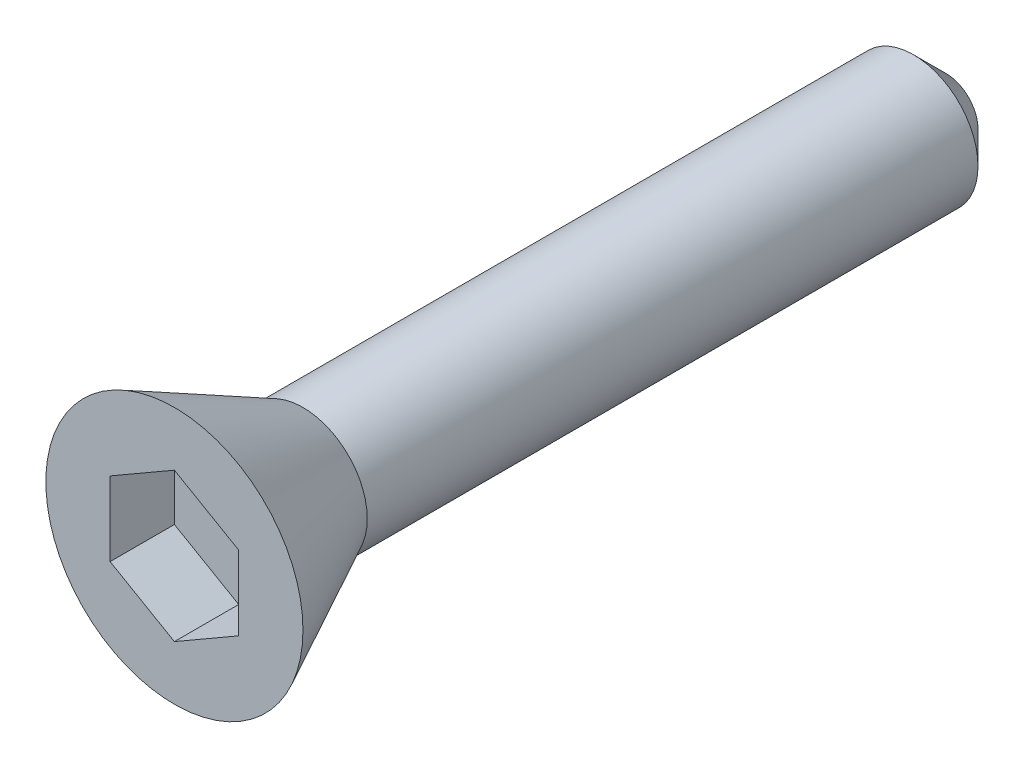
ISO-10303-21;
HEADER;
FILE_DESCRIPTION(('STEP AP214'),'2;1');
FILE_NAME('part.step','',(''),(''),'','','');
FILE_SCHEMA(('AUTOMOTIVE_DESIGN { 1 0 10303 214 1 1 1 1 }'));
ENDSEC;
DATA;
#1=APPLICATION_CONTEXT('core data for automotive mechanical design processes');
#2=APPLICATION_PROTOCOL_DEFINITION('international standard','automotive_design',2000,#1);
#3=PRODUCT_CONTEXT('',#1,'mechanical');
#4=PRODUCT('Part','Part','',(#3));
#5=PRODUCT_RELATED_PRODUCT_CATEGORY('part','',(#4));
#6=PRODUCT_DEFINITION_FORMATION('','',#4);
#7=PRODUCT_DEFINITION_CONTEXT('part definition',#1,'design');
#8=PRODUCT_DEFINITION('design','',#6,#7);
#9=PRODUCT_DEFINITION_SHAPE('','',#8);
#10=(LENGTH_UNIT() NAMED_UNIT(*) SI_UNIT(.MILLI.,.METRE.));
#11=(NAMED_UNIT(*) PLANE_ANGLE_UNIT() SI_UNIT($,.RADIAN.));
#12=(NAMED_UNIT(*) SI_UNIT($,.STERADIAN.) SOLID_ANGLE_UNIT());
#13=UNCERTAINTY_MEASURE_WITH_UNIT(LENGTH_MEASURE(1.E-05),#10,'distance_accuracy_value','');
#14=(GEOMETRIC_REPRESENTATION_CONTEXT(3) GLOBAL_UNCERTAINTY_ASSIGNED_CONTEXT((#13)) GLOBAL_UNIT_ASSIGNED_CONTEXT((#10,
#11,#12)) REPRESENTATION_CONTEXT('',''));
#15=CARTESIAN_POINT('',(0.,0.,0.));
#16=DIRECTION('',(0.,0.,1.));
#17=DIRECTION('',(1.,0.,0.));
#18=AXIS2_PLACEMENT_3D('',#15,#16,#17);
#19=CARTESIAN_POINT('',(0.,0.,0.));
#20=DIRECTION('',(0.,0.,-1.));
#21=DIRECTION('',(-1.,0.,0.));
#22=AXIS2_PLACEMENT_3D('',#19,#20,#21);
#23=PLANE('',#22);
#24=DIRECTION('',(-0.866025403784439,-0.5,0.));
#25=VECTOR('',#24,1.);
#26=CARTESIAN_POINT('',(0.,1.15470053837925,0.));
#27=LINE('',#26,#25);
#28=CARTESIAN_POINT('',(0.,1.15470053837925,0.));
#29=VERTEX_POINT('',#28);
#30=CARTESIAN_POINT('',(-1.,0.577350269189626,0.));
#31=VERTEX_POINT('',#30);
#32=EDGE_CURVE('E121',#29,#31,#27,.T.);
#33=ORIENTED_EDGE('',*,*,#32,.F.);
#34=DIRECTION('',(-0.866025403784439,0.5,0.));
#35=VECTOR('',#34,1.);
#36=CARTESIAN_POINT('',(1.,0.577350269189626,0.));
#37=LINE('',#36,#35);
#38=CARTESIAN_POINT('',(1.,0.577350269189626,0.));
#39=VERTEX_POINT('',#38);
#40=EDGE_CURVE('E47',#39,#29,#37,.T.);
#41=ORIENTED_EDGE('',*,*,#40,.F.);
#42=DIRECTION('',(0.,1.,0.));
#43=VECTOR('',#42,1.);
#44=CARTESIAN_POINT('',(1.,-0.577350269189626,0.));
#45=LINE('',#44,#43);
#46=CARTESIAN_POINT('',(1.,-0.577350269189626,0.));
#47=VERTEX_POINT('',#46);
#48=EDGE_CURVE('E130',#47,#39,#45,.T.);
#49=ORIENTED_EDGE('',*,*,#48,.F.);
#50=DIRECTION('',(0.866025403784439,0.5,0.));
#51=VECTOR('',#50,1.);
#52=CARTESIAN_POINT('',(0.,-1.15470053837925,0.));
#53=LINE('',#52,#51);
#54=CARTESIAN_POINT('',(0.,-1.15470053837925,0.));
#55=VERTEX_POINT('',#54);
#56=EDGE_CURVE('E128',#55,#47,#53,.T.);
#57=ORIENTED_EDGE('',*,*,#56,.F.);
#58=DIRECTION('',(0.866025403784439,-0.5,0.));
#59=VECTOR('',#58,1.);
#60=CARTESIAN_POINT('',(-1.,-0.577350269189626,0.));
#61=LINE('',#60,#59);
#62=CARTESIAN_POINT('',(-1.,-0.577350269189626,0.));
#63=VERTEX_POINT('',#62);
#64=EDGE_CURVE('E95',#63,#55,#61,.T.);
#65=ORIENTED_EDGE('',*,*,#64,.F.);
#66=DIRECTION('',(0.,-1.,0.));
#67=VECTOR('',#66,1.);
#68=CARTESIAN_POINT('',(-1.,0.577350269189626,0.));
#69=LINE('',#68,#67);
#70=EDGE_CURVE('E124',#31,#63,#69,.T.);
#71=ORIENTED_EDGE('',*,*,#70,.F.);
#72=EDGE_LOOP('',(#33,#41,#49,#57,#65,#71));
#73=FACE_BOUND('',#72,.T.);
#74=CARTESIAN_POINT('',(0.,0.,0.));
#75=DIRECTION('',(0.,0.,1.));
#76=DIRECTION('',(1.,0.,0.));
#77=AXIS2_PLACEMENT_3D('',#74,#75,#76);
#78=CIRCLE('',#77,2.);
#79=CARTESIAN_POINT('',(2.,0.,0.));
#80=VERTEX_POINT('',#79);
#81=EDGE_CURVE('E142',#80,#80,#78,.T.);
#82=ORIENTED_EDGE('',*,*,#81,.T.);
#83=EDGE_LOOP('',(#82));
#84=FACE_BOUND('',#83,.T.);
#85=ADVANCED_FACE('F32',(#73,#84),#23,.F.);
#86=CARTESIAN_POINT('',(0.,0.,-2.));
#87=DIRECTION('',(0.,0.,1.));
#88=DIRECTION('',(1.,0.,0.));
#89=AXIS2_PLACEMENT_3D('',#86,#87,#88);
#90=CONICAL_SURFACE('',#89,1.,0.463647609000806);
#91=ORIENTED_EDGE('',*,*,#81,.F.);
#92=EDGE_LOOP('',(#91));
#93=FACE_BOUND('',#92,.T.);
#94=CARTESIAN_POINT('',(0.,0.,-2.));
#95=DIRECTION('',(0.,0.,1.));
#96=DIRECTION('',(1.,0.,0.));
#97=AXIS2_PLACEMENT_3D('',#94,#95,#96);
#98=CIRCLE('',#97,1.);
#99=CARTESIAN_POINT('',(1.,0.,-2.));
#100=VERTEX_POINT('',#99);
#101=EDGE_CURVE('E134',#100,#100,#98,.T.);
#102=ORIENTED_EDGE('',*,*,#101,.T.);
#103=EDGE_LOOP('',(#102));
#104=FACE_BOUND('',#103,.T.);
#105=ADVANCED_FACE('F159',(#93,#104),#90,.T.);
#106=CARTESIAN_POINT('',(0.,0.,58.5147444804715));
#107=DIRECTION('',(0.,0.,1.));
#108=DIRECTION('',(1.,0.,0.));
#109=AXIS2_PLACEMENT_3D('',#106,#107,#108);
#110=CYLINDRICAL_SURFACE('',#109,1.);
#111=CARTESIAN_POINT('',(0.,0.,-11.5));
#112=DIRECTION('',(0.,0.,1.));
#113=DIRECTION('',(1.,0.,0.));
#114=AXIS2_PLACEMENT_3D('',#111,#112,#113);
#115=CIRCLE('',#114,1.);
#116=CARTESIAN_POINT('',(1.,0.,-11.5));
#117=VERTEX_POINT('',#116);
#118=EDGE_CURVE('E40',#117,#117,#115,.T.);
#119=ORIENTED_EDGE('',*,*,#118,.T.);
#120=EDGE_LOOP('',(#119));
#121=FACE_BOUND('',#120,.T.);
#122=ORIENTED_EDGE('',*,*,#101,.F.);
#123=EDGE_LOOP('',(#122));
#124=FACE_BOUND('',#123,.T.);
#125=ADVANCED_FACE('F147',(#121,#124),#110,.T.);
#126=CARTESIAN_POINT('',(0.,1.,-12.));
#127=DIRECTION('',(0.,0.,1.));
#128=DIRECTION('',(1.,0.,0.));
#129=AXIS2_PLACEMENT_3D('',#126,#127,#128);
#130=PLANE('',#129);
#131=CARTESIAN_POINT('',(0.,0.,-12.));
#132=DIRECTION('',(0.,0.,1.));
#133=DIRECTION('',(1.,0.,0.));
#134=AXIS2_PLACEMENT_3D('',#131,#132,#133);
#135=CIRCLE('',#134,0.500000000000002);
#136=CARTESIAN_POINT('',(0.500000000000002,0.,-12.));
#137=VERTEX_POINT('',#136);
#138=EDGE_CURVE('E11',#137,#137,#135,.F.);
#139=ORIENTED_EDGE('',*,*,#138,.T.);
#140=EDGE_LOOP('',(#139));
#141=FACE_BOUND('',#140,.T.);
#142=ADVANCED_FACE('F171',(#141),#130,.F.);
#143=CARTESIAN_POINT('',(1.,0.577350269189626,-1.));
#144=DIRECTION('',(0.5,0.866025403784439,0.));
#145=DIRECTION('',(-0.866025403784439,0.5,0.));
#146=AXIS2_PLACEMENT_3D('',#143,#144,#145);
#147=PLANE('',#146);
#148=ORIENTED_EDGE('',*,*,#40,.T.);
#149=DIRECTION('',(0.,0.,1.));
#150=VECTOR('',#149,1.);
#151=CARTESIAN_POINT('',(0.,1.15470053837925,-1.));
#152=LINE('',#151,#150);
#153=CARTESIAN_POINT('',(0.,1.15470053837925,-1.));
#154=VERTEX_POINT('',#153);
#155=EDGE_CURVE('E77',#154,#29,#152,.T.);
#156=ORIENTED_EDGE('',*,*,#155,.F.);
#157=DIRECTION('',(-0.866025403784439,0.5,0.));
#158=VECTOR('',#157,1.);
#159=CARTESIAN_POINT('',(1.,0.577350269189626,-1.));
#160=LINE('',#159,#158);
#161=CARTESIAN_POINT('',(1.,0.577350269189626,-1.));
#162=VERTEX_POINT('',#161);
#163=EDGE_CURVE('E132',#162,#154,#160,.T.);
#164=ORIENTED_EDGE('',*,*,#163,.F.);
#165=DIRECTION('',(0.,0.,1.));
#166=VECTOR('',#165,1.);
#167=CARTESIAN_POINT('',(1.,0.577350269189626,-1.));
#168=LINE('',#167,#166);
#169=EDGE_CURVE('E55',#162,#39,#168,.T.);
#170=ORIENTED_EDGE('',*,*,#169,.T.);
#171=EDGE_LOOP('',(#148,#156,#164,#170));
#172=FACE_BOUND('',#171,.T.);
#173=ADVANCED_FACE('F174',(#172),#147,.F.);
#174=CARTESIAN_POINT('',(1.,-0.577350269189626,-1.));
#175=DIRECTION('',(1.,0.,0.));
#176=DIRECTION('',(0.,0.,-1.));
#177=AXIS2_PLACEMENT_3D('',#174,#175,#176);
#178=PLANE('',#177);
#179=ORIENTED_EDGE('',*,*,#48,.T.);
#180=ORIENTED_EDGE('',*,*,#169,.F.);
#181=DIRECTION('',(0.,1.,0.));
#182=VECTOR('',#181,1.);
#183=CARTESIAN_POINT('',(1.,-0.577350269189626,-1.));
#184=LINE('',#183,#182);
#185=CARTESIAN_POINT('',(1.,-0.577350269189626,-1.));
#186=VERTEX_POINT('',#185);
#187=EDGE_CURVE('E107',#186,#162,#184,.T.);
#188=ORIENTED_EDGE('',*,*,#187,.F.);
#189=DIRECTION('',(0.,0.,1.));
#190=VECTOR('',#189,1.);
#191=CARTESIAN_POINT('',(1.,-0.577350269189626,-1.));
#192=LINE('',#191,#190);
#193=EDGE_CURVE('E99',#186,#47,#192,.T.);
#194=ORIENTED_EDGE('',*,*,#193,.T.);
#195=EDGE_LOOP('',(#179,#180,#188,#194));
#196=FACE_BOUND('',#195,.T.);
#197=ADVANCED_FACE('F178',(#196),#178,.F.);
#198=CARTESIAN_POINT('',(0.,-1.15470053837925,-1.));
#199=DIRECTION('',(0.5,-0.866025403784439,0.));
#200=DIRECTION('',(0.866025403784439,0.5,0.));
#201=AXIS2_PLACEMENT_3D('',#198,#199,#200);
#202=PLANE('',#201);
#203=ORIENTED_EDGE('',*,*,#56,.T.);
#204=ORIENTED_EDGE('',*,*,#193,.F.);
#205=DIRECTION('',(0.866025403784439,0.5,0.));
#206=VECTOR('',#205,1.);
#207=CARTESIAN_POINT('',(0.,-1.15470053837925,-1.));
#208=LINE('',#207,#206);
#209=CARTESIAN_POINT('',(0.,-1.15470053837925,-1.));
#210=VERTEX_POINT('',#209);
#211=EDGE_CURVE('E103',#210,#186,#208,.T.);
#212=ORIENTED_EDGE('',*,*,#211,.F.);
#213=DIRECTION('',(0.,0.,1.));
#214=VECTOR('',#213,1.);
#215=CARTESIAN_POINT('',(0.,-1.15470053837925,-1.));
#216=LINE('',#215,#214);
#217=EDGE_CURVE('E88',#210,#55,#216,.T.);
#218=ORIENTED_EDGE('',*,*,#217,.T.);
#219=EDGE_LOOP('',(#203,#204,#212,#218));
#220=FACE_BOUND('',#219,.T.);
#221=ADVANCED_FACE('F104',(#220),#202,.F.);
#222=CARTESIAN_POINT('',(-1.,-0.577350269189626,-1.));
#223=DIRECTION('',(-0.5,-0.866025403784439,0.));
#224=DIRECTION('',(0.866025403784439,-0.5,0.));
#225=AXIS2_PLACEMENT_3D('',#222,#223,#224);
#226=PLANE('',#225);
#227=ORIENTED_EDGE('',*,*,#64,.T.);
#228=ORIENTED_EDGE('',*,*,#217,.F.);
#229=DIRECTION('',(0.866025403784439,-0.5,0.));
#230=VECTOR('',#229,1.);
#231=CARTESIAN_POINT('',(-1.,-0.577350269189626,-1.));
#232=LINE('',#231,#230);
#233=CARTESIAN_POINT('',(-1.,-0.577350269189626,-1.));
#234=VERTEX_POINT('',#233);
#235=EDGE_CURVE('E92',#234,#210,#232,.T.);
#236=ORIENTED_EDGE('',*,*,#235,.F.);
#237=DIRECTION('',(0.,0.,1.));
#238=VECTOR('',#237,1.);
#239=CARTESIAN_POINT('',(-1.,-0.577350269189626,-1.));
#240=LINE('',#239,#238);
#241=EDGE_CURVE('E100',#234,#63,#240,.T.);
#242=ORIENTED_EDGE('',*,*,#241,.T.);
#243=EDGE_LOOP('',(#227,#228,#236,#242));
#244=FACE_BOUND('',#243,.T.);
#245=ADVANCED_FACE('F90',(#244),#226,.F.);
#246=CARTESIAN_POINT('',(-1.,0.577350269189626,-1.));
#247=DIRECTION('',(-1.,0.,0.));
#248=DIRECTION('',(0.,0.,1.));
#249=AXIS2_PLACEMENT_3D('',#246,#247,#248);
#250=PLANE('',#249);
#251=ORIENTED_EDGE('',*,*,#70,.T.);
#252=ORIENTED_EDGE('',*,*,#241,.F.);
#253=DIRECTION('',(0.,-1.,0.));
#254=VECTOR('',#253,1.);
#255=CARTESIAN_POINT('',(-1.,0.577350269189626,-1.));
#256=LINE('',#255,#254);
#257=CARTESIAN_POINT('',(-1.,0.577350269189626,-1.));
#258=VERTEX_POINT('',#257);
#259=EDGE_CURVE('E113',#258,#234,#256,.T.);
#260=ORIENTED_EDGE('',*,*,#259,.F.);
#261=DIRECTION('',(0.,0.,1.));
#262=VECTOR('',#261,1.);
#263=CARTESIAN_POINT('',(-1.,0.577350269189626,-1.));
#264=LINE('',#263,#262);
#265=EDGE_CURVE('E137',#258,#31,#264,.T.);
#266=ORIENTED_EDGE('',*,*,#265,.T.);
#267=EDGE_LOOP('',(#251,#252,#260,#266));
#268=FACE_BOUND('',#267,.T.);
#269=ADVANCED_FACE('F181',(#268),#250,.F.);
#270=CARTESIAN_POINT('',(0.,1.15470053837925,-1.));
#271=DIRECTION('',(-0.5,0.866025403784439,0.));
#272=DIRECTION('',(-0.866025403784439,-0.5,0.));
#273=AXIS2_PLACEMENT_3D('',#270,#271,#272);
#274=PLANE('',#273);
#275=ORIENTED_EDGE('',*,*,#32,.T.);
#276=ORIENTED_EDGE('',*,*,#265,.F.);
#277=DIRECTION('',(-0.866025403784439,-0.5,0.));
#278=VECTOR('',#277,1.);
#279=CARTESIAN_POINT('',(0.,1.15470053837925,-1.));
#280=LINE('',#279,#278);
#281=EDGE_CURVE('E115',#154,#258,#280,.T.);
#282=ORIENTED_EDGE('',*,*,#281,.F.);
#283=ORIENTED_EDGE('',*,*,#155,.T.);
#284=EDGE_LOOP('',(#275,#276,#282,#283));
#285=FACE_BOUND('',#284,.T.);
#286=ADVANCED_FACE('F155',(#285),#274,.F.);
#287=CARTESIAN_POINT('',(0.,0.,-1.));
#288=DIRECTION('',(0.,0.,1.));
#289=DIRECTION('',(1.,0.,0.));
#290=AXIS2_PLACEMENT_3D('',#287,#288,#289);
#291=PLANE('',#290);
#292=ORIENTED_EDGE('',*,*,#163,.T.);
#293=ORIENTED_EDGE('',*,*,#281,.T.);
#294=ORIENTED_EDGE('',*,*,#259,.T.);
#295=ORIENTED_EDGE('',*,*,#235,.T.);
#296=ORIENTED_EDGE('',*,*,#211,.T.);
#297=ORIENTED_EDGE('',*,*,#187,.T.);
#298=EDGE_LOOP('',(#292,#293,#294,#295,#296,#297));
#299=FACE_BOUND('',#298,.T.);
#300=ADVANCED_FACE('F110',(#299),#291,.T.);
#301=CARTESIAN_POINT('',(0.,0.,-11.5));
#302=DIRECTION('',(0.,0.,1.));
#303=DIRECTION('',(1.,0.,0.));
#304=AXIS2_PLACEMENT_3D('',#301,#302,#303);
#305=CONICAL_SURFACE('',#304,1.,0.785398163397449);
#306=ORIENTED_EDGE('',*,*,#138,.F.);
#307=EDGE_LOOP('',(#306));
#308=FACE_BOUND('',#307,.T.);
#309=ORIENTED_EDGE('',*,*,#118,.F.);
#310=EDGE_LOOP('',(#309));
#311=FACE_BOUND('',#310,.T.);
#312=ADVANCED_FACE('F34',(#308,#311),#305,.T.);
#313=CLOSED_SHELL('',(#85,#105,#125,#142,#173,#197,#221,#245,#269,#286,#300,#312));
#314=MANIFOLD_SOLID_BREP('B2',#313);
#315=ADVANCED_BREP_SHAPE_REPRESENTATION('',(#18,#314),#14);
#316=SHAPE_DEFINITION_REPRESENTATION(#9,#315);
ENDSEC;
END-ISO-10303-21;
